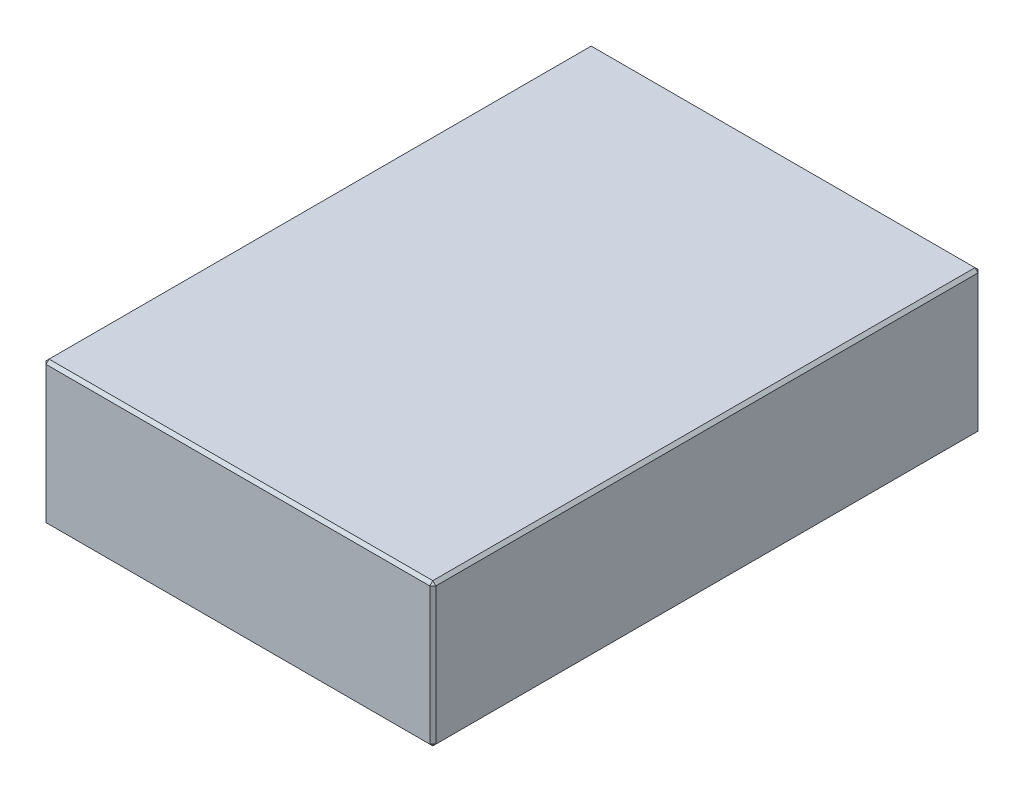
ISO-10303-21;
HEADER;
FILE_DESCRIPTION(('STEP AP214'),'2;1');
FILE_NAME('part.step','',(''),(''),'','','');
FILE_SCHEMA(('AUTOMOTIVE_DESIGN { 1 0 10303 214 1 1 1 1 }'));
ENDSEC;
DATA;
#1=APPLICATION_CONTEXT('core data for automotive mechanical design processes');
#2=APPLICATION_PROTOCOL_DEFINITION('international standard','automotive_design',2000,#1);
#3=PRODUCT_CONTEXT('',#1,'mechanical');
#4=PRODUCT('Part','Part','',(#3));
#5=PRODUCT_RELATED_PRODUCT_CATEGORY('part','',(#4));
#6=PRODUCT_DEFINITION_FORMATION('','',#4);
#7=PRODUCT_DEFINITION_CONTEXT('part definition',#1,'design');
#8=PRODUCT_DEFINITION('design','',#6,#7);
#9=PRODUCT_DEFINITION_SHAPE('','',#8);
#10=(LENGTH_UNIT() NAMED_UNIT(*) SI_UNIT(.MILLI.,.METRE.));
#11=(NAMED_UNIT(*) PLANE_ANGLE_UNIT() SI_UNIT($,.RADIAN.));
#12=(NAMED_UNIT(*) SI_UNIT($,.STERADIAN.) SOLID_ANGLE_UNIT());
#13=UNCERTAINTY_MEASURE_WITH_UNIT(LENGTH_MEASURE(1.E-05),#10,'distance_accuracy_value','');
#14=(GEOMETRIC_REPRESENTATION_CONTEXT(3) GLOBAL_UNCERTAINTY_ASSIGNED_CONTEXT((#13)) GLOBAL_UNIT_ASSIGNED_CONTEXT((#10,
#11,#12)) REPRESENTATION_CONTEXT('',''));
#15=CARTESIAN_POINT('',(0.,0.,0.));
#16=DIRECTION('',(0.,0.,1.));
#17=DIRECTION('',(1.,0.,0.));
#18=AXIS2_PLACEMENT_3D('',#15,#16,#17);
#19=CARTESIAN_POINT('',(0.,23.5,0.));
#20=DIRECTION('',(1.,0.,0.));
#21=DIRECTION('',(0.,0.,-1.));
#22=AXIS2_PLACEMENT_3D('',#19,#20,#21);
#23=PLANE('',#22);
#24=DIRECTION('',(0.,-1.,0.));
#25=VECTOR('',#24,1.);
#26=CARTESIAN_POINT('',(0.,23.5,-89.5));
#27=LINE('',#26,#25);
#28=CARTESIAN_POINT('',(0.,23.,-89.5));
#29=VERTEX_POINT('',#28);
#30=CARTESIAN_POINT('',(0.,0.5,-89.5));
#31=VERTEX_POINT('',#30);
#32=EDGE_CURVE('E147',#29,#31,#27,.T.);
#33=ORIENTED_EDGE('',*,*,#32,.T.);
#34=DIRECTION('',(0.,0.,1.));
#35=VECTOR('',#34,1.);
#36=CARTESIAN_POINT('',(0.,0.5,0.));
#37=LINE('',#36,#35);
#38=CARTESIAN_POINT('',(0.,0.5,-0.5));
#39=VERTEX_POINT('',#38);
#40=EDGE_CURVE('E142',#31,#39,#37,.T.);
#41=ORIENTED_EDGE('',*,*,#40,.T.);
#42=DIRECTION('',(0.,1.,0.));
#43=VECTOR('',#42,1.);
#44=CARTESIAN_POINT('',(0.,23.5,-0.5));
#45=LINE('',#44,#43);
#46=CARTESIAN_POINT('',(0.,23.,-0.5));
#47=VERTEX_POINT('',#46);
#48=EDGE_CURVE('E137',#39,#47,#45,.T.);
#49=ORIENTED_EDGE('',*,*,#48,.T.);
#50=DIRECTION('',(0.,0.,-1.));
#51=VECTOR('',#50,1.);
#52=CARTESIAN_POINT('',(0.,23.,0.));
#53=LINE('',#52,#51);
#54=EDGE_CURVE('E139',#47,#29,#53,.T.);
#55=ORIENTED_EDGE('',*,*,#54,.T.);
#56=EDGE_LOOP('',(#33,#41,#49,#55));
#57=FACE_BOUND('',#56,.T.);
#58=ADVANCED_FACE('F47',(#57),#23,.F.);
#59=CARTESIAN_POINT('',(0.,23.5,0.));
#60=DIRECTION('',(0.,0.,-1.));
#61=DIRECTION('',(-1.,0.,0.));
#62=AXIS2_PLACEMENT_3D('',#59,#60,#61);
#63=PLANE('',#62);
#64=DIRECTION('',(-1.,0.,0.));
#65=VECTOR('',#64,1.);
#66=CARTESIAN_POINT('',(0.,23.,0.));
#67=LINE('',#66,#65);
#68=CARTESIAN_POINT('',(63.5,23.,0.));
#69=VERTEX_POINT('',#68);
#70=CARTESIAN_POINT('',(0.5,23.,0.));
#71=VERTEX_POINT('',#70);
#72=EDGE_CURVE('E259',#69,#71,#67,.T.);
#73=ORIENTED_EDGE('',*,*,#72,.T.);
#74=DIRECTION('',(0.,-1.,0.));
#75=VECTOR('',#74,1.);
#76=CARTESIAN_POINT('',(0.5,23.5,0.));
#77=LINE('',#76,#75);
#78=CARTESIAN_POINT('',(0.5,0.5,0.));
#79=VERTEX_POINT('',#78);
#80=EDGE_CURVE('E171',#71,#79,#77,.T.);
#81=ORIENTED_EDGE('',*,*,#80,.T.);
#82=DIRECTION('',(1.,0.,0.));
#83=VECTOR('',#82,1.);
#84=CARTESIAN_POINT('',(64.,0.5,0.));
#85=LINE('',#84,#83);
#86=CARTESIAN_POINT('',(63.5,0.5,0.));
#87=VERTEX_POINT('',#86);
#88=EDGE_CURVE('E270',#79,#87,#85,.T.);
#89=ORIENTED_EDGE('',*,*,#88,.T.);
#90=DIRECTION('',(0.,1.,0.));
#91=VECTOR('',#90,1.);
#92=CARTESIAN_POINT('',(63.5,23.5,0.));
#93=LINE('',#92,#91);
#94=EDGE_CURVE('E263',#87,#69,#93,.T.);
#95=ORIENTED_EDGE('',*,*,#94,.T.);
#96=EDGE_LOOP('',(#73,#81,#89,#95));
#97=FACE_BOUND('',#96,.T.);
#98=ADVANCED_FACE('F384',(#97),#63,.F.);
#99=CARTESIAN_POINT('',(64.,23.5,0.));
#100=DIRECTION('',(-1.,0.,0.));
#101=DIRECTION('',(0.,0.,1.));
#102=AXIS2_PLACEMENT_3D('',#99,#100,#101);
#103=PLANE('',#102);
#104=DIRECTION('',(0.,0.,-1.));
#105=VECTOR('',#104,1.);
#106=CARTESIAN_POINT('',(64.,0.5,-90.));
#107=LINE('',#106,#105);
#108=CARTESIAN_POINT('',(64.,0.5,-0.5));
#109=VERTEX_POINT('',#108);
#110=CARTESIAN_POINT('',(64.,0.5,-89.5));
#111=VERTEX_POINT('',#110);
#112=EDGE_CURVE('E254',#109,#111,#107,.T.);
#113=ORIENTED_EDGE('',*,*,#112,.T.);
#114=DIRECTION('',(0.,1.,0.));
#115=VECTOR('',#114,1.);
#116=CARTESIAN_POINT('',(64.,23.5,-89.5));
#117=LINE('',#116,#115);
#118=CARTESIAN_POINT('',(64.,23.,-89.5));
#119=VERTEX_POINT('',#118);
#120=EDGE_CURVE('E251',#111,#119,#117,.T.);
#121=ORIENTED_EDGE('',*,*,#120,.T.);
#122=DIRECTION('',(0.,0.,1.));
#123=VECTOR('',#122,1.);
#124=CARTESIAN_POINT('',(64.,23.,0.));
#125=LINE('',#124,#123);
#126=CARTESIAN_POINT('',(64.,23.,-0.5));
#127=VERTEX_POINT('',#126);
#128=EDGE_CURVE('E243',#119,#127,#125,.T.);
#129=ORIENTED_EDGE('',*,*,#128,.T.);
#130=DIRECTION('',(0.,-1.,0.));
#131=VECTOR('',#130,1.);
#132=CARTESIAN_POINT('',(64.,23.5,-0.5));
#133=LINE('',#132,#131);
#134=EDGE_CURVE('E247',#127,#109,#133,.T.);
#135=ORIENTED_EDGE('',*,*,#134,.T.);
#136=EDGE_LOOP('',(#113,#121,#129,#135));
#137=FACE_BOUND('',#136,.T.);
#138=ADVANCED_FACE('F252',(#137),#103,.F.);
#139=CARTESIAN_POINT('',(0.,23.5,-90.));
#140=DIRECTION('',(0.,0.,1.));
#141=DIRECTION('',(1.,0.,0.));
#142=AXIS2_PLACEMENT_3D('',#139,#140,#141);
#143=PLANE('',#142);
#144=DIRECTION('',(-1.,0.,0.));
#145=VECTOR('',#144,1.);
#146=CARTESIAN_POINT('',(0.,0.5,-90.));
#147=LINE('',#146,#145);
#148=CARTESIAN_POINT('',(63.5,0.5,-90.));
#149=VERTEX_POINT('',#148);
#150=CARTESIAN_POINT('',(0.5,0.5,-90.));
#151=VERTEX_POINT('',#150);
#152=EDGE_CURVE('E335',#149,#151,#147,.T.);
#153=ORIENTED_EDGE('',*,*,#152,.T.);
#154=DIRECTION('',(0.,1.,0.));
#155=VECTOR('',#154,1.);
#156=CARTESIAN_POINT('',(0.5,23.5,-90.));
#157=LINE('',#156,#155);
#158=CARTESIAN_POINT('',(0.5,23.,-90.));
#159=VERTEX_POINT('',#158);
#160=EDGE_CURVE('E248',#151,#159,#157,.T.);
#161=ORIENTED_EDGE('',*,*,#160,.T.);
#162=DIRECTION('',(1.,0.,0.));
#163=VECTOR('',#162,1.);
#164=CARTESIAN_POINT('',(0.,23.,-90.));
#165=LINE('',#164,#163);
#166=CARTESIAN_POINT('',(63.5,23.,-90.));
#167=VERTEX_POINT('',#166);
#168=EDGE_CURVE('E326',#159,#167,#165,.T.);
#169=ORIENTED_EDGE('',*,*,#168,.T.);
#170=DIRECTION('',(0.,-1.,0.));
#171=VECTOR('',#170,1.);
#172=CARTESIAN_POINT('',(63.5,23.5,-90.));
#173=LINE('',#172,#171);
#174=EDGE_CURVE('E329',#167,#149,#173,.T.);
#175=ORIENTED_EDGE('',*,*,#174,.T.);
#176=EDGE_LOOP('',(#153,#161,#169,#175));
#177=FACE_BOUND('',#176,.T.);
#178=ADVANCED_FACE('F367',(#177),#143,.F.);
#179=CARTESIAN_POINT('',(0.,23.5,0.));
#180=DIRECTION('',(0.,-1.,0.));
#181=DIRECTION('',(0.,0.,-1.));
#182=AXIS2_PLACEMENT_3D('',#179,#180,#181);
#183=PLANE('',#182);
#184=DIRECTION('',(0.,0.,-1.));
#185=VECTOR('',#184,1.);
#186=CARTESIAN_POINT('',(63.5,23.5,0.));
#187=LINE('',#186,#185);
#188=CARTESIAN_POINT('',(63.5,23.5,-0.5));
#189=VERTEX_POINT('',#188);
#190=CARTESIAN_POINT('',(63.5,23.5,-89.5));
#191=VERTEX_POINT('',#190);
#192=EDGE_CURVE('E58',#189,#191,#187,.T.);
#193=ORIENTED_EDGE('',*,*,#192,.T.);
#194=DIRECTION('',(-1.,0.,0.));
#195=VECTOR('',#194,1.);
#196=CARTESIAN_POINT('',(0.,23.5,-89.5));
#197=LINE('',#196,#195);
#198=CARTESIAN_POINT('',(0.5,23.5,-89.5));
#199=VERTEX_POINT('',#198);
#200=EDGE_CURVE('E11',#191,#199,#197,.T.);
#201=ORIENTED_EDGE('',*,*,#200,.T.);
#202=DIRECTION('',(0.,0.,1.));
#203=VECTOR('',#202,1.);
#204=CARTESIAN_POINT('',(0.5,23.5,0.));
#205=LINE('',#204,#203);
#206=CARTESIAN_POINT('',(0.5,23.5,-0.5));
#207=VERTEX_POINT('',#206);
#208=EDGE_CURVE('E275',#199,#207,#205,.T.);
#209=ORIENTED_EDGE('',*,*,#208,.T.);
#210=DIRECTION('',(1.,0.,0.));
#211=VECTOR('',#210,1.);
#212=CARTESIAN_POINT('',(0.,23.5,-0.5));
#213=LINE('',#212,#211);
#214=EDGE_CURVE('E69',#207,#189,#213,.T.);
#215=ORIENTED_EDGE('',*,*,#214,.T.);
#216=EDGE_LOOP('',(#193,#201,#209,#215));
#217=FACE_BOUND('',#216,.T.);
#218=ADVANCED_FACE('F488',(#217),#183,.F.);
#219=CARTESIAN_POINT('',(0.,0.,0.));
#220=DIRECTION('',(0.,-1.,0.));
#221=DIRECTION('',(0.,0.,-1.));
#222=AXIS2_PLACEMENT_3D('',#219,#220,#221);
#223=PLANE('',#222);
#224=DIRECTION('',(-1.,0.,0.));
#225=VECTOR('',#224,1.);
#226=CARTESIAN_POINT('',(0.,0.,-0.5));
#227=LINE('',#226,#225);
#228=CARTESIAN_POINT('',(63.5,0.,-0.5));
#229=VERTEX_POINT('',#228);
#230=CARTESIAN_POINT('',(0.5,0.,-0.5));
#231=VERTEX_POINT('',#230);
#232=EDGE_CURVE('E321',#229,#231,#227,.T.);
#233=ORIENTED_EDGE('',*,*,#232,.T.);
#234=DIRECTION('',(0.,0.,-1.));
#235=VECTOR('',#234,1.);
#236=CARTESIAN_POINT('',(0.5,0.,-90.));
#237=LINE('',#236,#235);
#238=CARTESIAN_POINT('',(0.5,0.,-89.5));
#239=VERTEX_POINT('',#238);
#240=EDGE_CURVE('E315',#231,#239,#237,.T.);
#241=ORIENTED_EDGE('',*,*,#240,.T.);
#242=DIRECTION('',(1.,0.,0.));
#243=VECTOR('',#242,1.);
#244=CARTESIAN_POINT('',(64.,0.,-89.5));
#245=LINE('',#244,#243);
#246=CARTESIAN_POINT('',(63.5,0.,-89.5));
#247=VERTEX_POINT('',#246);
#248=EDGE_CURVE('E308',#239,#247,#245,.T.);
#249=ORIENTED_EDGE('',*,*,#248,.T.);
#250=DIRECTION('',(0.,0.,1.));
#251=VECTOR('',#250,1.);
#252=CARTESIAN_POINT('',(63.5,0.,0.));
#253=LINE('',#252,#251);
#254=EDGE_CURVE('E316',#247,#229,#253,.T.);
#255=ORIENTED_EDGE('',*,*,#254,.T.);
#256=EDGE_LOOP('',(#233,#241,#249,#255));
#257=FACE_BOUND('',#256,.T.);
#258=ADVANCED_FACE('F319',(#257),#223,.T.);
#259=CARTESIAN_POINT('',(63.5,23.5,0.));
#260=DIRECTION('',(-0.707106781186547,-0.707106781186547,0.));
#261=DIRECTION('',(0.,0.,-1.));
#262=AXIS2_PLACEMENT_3D('',#259,#260,#261);
#263=PLANE('',#262);
#264=DIRECTION('',(-0.707106781186547,0.707106781186547,0.));
#265=VECTOR('',#264,1.);
#266=CARTESIAN_POINT('',(64.,23.,-89.5));
#267=LINE('',#266,#265);
#268=EDGE_CURVE('E52',#191,#119,#267,.F.);
#269=ORIENTED_EDGE('',*,*,#268,.F.);
#270=ORIENTED_EDGE('',*,*,#192,.F.);
#271=DIRECTION('',(0.707106781186547,-0.707106781186547,0.));
#272=VECTOR('',#271,1.);
#273=CARTESIAN_POINT('',(63.75,23.25,-0.5));
#274=LINE('',#273,#272);
#275=EDGE_CURVE('E226',#127,#189,#274,.F.);
#276=ORIENTED_EDGE('',*,*,#275,.F.);
#277=ORIENTED_EDGE('',*,*,#128,.F.);
#278=EDGE_LOOP('',(#269,#270,#276,#277));
#279=FACE_BOUND('',#278,.T.);
#280=ADVANCED_FACE('F50',(#279),#263,.F.);
#281=CARTESIAN_POINT('',(64.,23.,-89.5));
#282=DIRECTION('',(0.577350269189626,0.577350269189626,-0.577350269189626));
#283=DIRECTION('',(-0.707106781186547,0.,-0.707106781186547));
#284=AXIS2_PLACEMENT_3D('',#281,#282,#283);
#285=PLANE('',#284);
#286=DIRECTION('',(0.,-0.707106781186547,-0.707106781186547));
#287=VECTOR('',#286,1.);
#288=CARTESIAN_POINT('',(63.5,23.25,-89.75));
#289=LINE('',#288,#287);
#290=EDGE_CURVE('E220',#191,#167,#289,.T.);
#291=ORIENTED_EDGE('',*,*,#290,.F.);
#292=ORIENTED_EDGE('',*,*,#268,.T.);
#293=DIRECTION('',(0.707106781186547,0.,0.707106781186547));
#294=VECTOR('',#293,1.);
#295=CARTESIAN_POINT('',(64.,23.,-89.5));
#296=LINE('',#295,#294);
#297=EDGE_CURVE('E224',#167,#119,#296,.T.);
#298=ORIENTED_EDGE('',*,*,#297,.F.);
#299=EDGE_LOOP('',(#291,#292,#298));
#300=FACE_BOUND('',#299,.T.);
#301=ADVANCED_FACE('F239',(#300),#285,.T.);
#302=CARTESIAN_POINT('',(63.5,23.,0.));
#303=DIRECTION('',(0.577350269189626,0.577350269189626,0.577350269189626));
#304=DIRECTION('',(0.707106781186547,0.,-0.707106781186547));
#305=AXIS2_PLACEMENT_3D('',#302,#303,#304);
#306=PLANE('',#305);
#307=DIRECTION('',(-0.707106781186547,0.,0.707106781186547));
#308=VECTOR('',#307,1.);
#309=CARTESIAN_POINT('',(63.5,23.,0.));
#310=LINE('',#309,#308);
#311=EDGE_CURVE('E212',#127,#69,#310,.T.);
#312=ORIENTED_EDGE('',*,*,#311,.F.);
#313=ORIENTED_EDGE('',*,*,#275,.T.);
#314=DIRECTION('',(0.,0.707106781186547,-0.707106781186547));
#315=VECTOR('',#314,1.);
#316=CARTESIAN_POINT('',(63.5,23.,0.));
#317=LINE('',#316,#315);
#318=EDGE_CURVE('E216',#69,#189,#317,.T.);
#319=ORIENTED_EDGE('',*,*,#318,.F.);
#320=EDGE_LOOP('',(#312,#313,#319));
#321=FACE_BOUND('',#320,.T.);
#322=ADVANCED_FACE('F475',(#321),#306,.T.);
#323=CARTESIAN_POINT('',(63.5,23.5,-90.));
#324=DIRECTION('',(-0.707106781186547,0.,0.707106781186547));
#325=DIRECTION('',(0.,-1.,0.));
#326=AXIS2_PLACEMENT_3D('',#323,#324,#325);
#327=PLANE('',#326);
#328=ORIENTED_EDGE('',*,*,#297,.T.);
#329=ORIENTED_EDGE('',*,*,#120,.F.);
#330=DIRECTION('',(-0.707106781186547,0.,-0.707106781186547));
#331=VECTOR('',#330,1.);
#332=CARTESIAN_POINT('',(63.75,0.5,-89.75));
#333=LINE('',#332,#331);
#334=EDGE_CURVE('E204',#149,#111,#333,.F.);
#335=ORIENTED_EDGE('',*,*,#334,.F.);
#336=ORIENTED_EDGE('',*,*,#174,.F.);
#337=EDGE_LOOP('',(#328,#329,#335,#336));
#338=FACE_BOUND('',#337,.T.);
#339=ADVANCED_FACE('F369',(#338),#327,.F.);
#340=CARTESIAN_POINT('',(0.,23.5,-89.5));
#341=DIRECTION('',(0.,-0.707106781186547,0.707106781186547));
#342=DIRECTION('',(-1.,0.,0.));
#343=AXIS2_PLACEMENT_3D('',#340,#341,#342);
#344=PLANE('',#343);
#345=ORIENTED_EDGE('',*,*,#290,.T.);
#346=ORIENTED_EDGE('',*,*,#168,.F.);
#347=DIRECTION('',(0.,0.707106781186547,0.707106781186547));
#348=VECTOR('',#347,1.);
#349=CARTESIAN_POINT('',(0.5,23.,-90.));
#350=LINE('',#349,#348);
#351=EDGE_CURVE('E200',#199,#159,#350,.F.);
#352=ORIENTED_EDGE('',*,*,#351,.F.);
#353=ORIENTED_EDGE('',*,*,#200,.F.);
#354=EDGE_LOOP('',(#345,#346,#352,#353));
#355=FACE_BOUND('',#354,.T.);
#356=ADVANCED_FACE('F466',(#355),#344,.F.);
#357=CARTESIAN_POINT('',(0.5,23.5,0.));
#358=DIRECTION('',(0.707106781186547,-0.707106781186547,0.));
#359=DIRECTION('',(0.,0.,1.));
#360=AXIS2_PLACEMENT_3D('',#357,#358,#359);
#361=PLANE('',#360);
#362=DIRECTION('',(0.707106781186547,0.707106781186547,0.));
#363=VECTOR('',#362,1.);
#364=CARTESIAN_POINT('',(0.,23.,-0.5));
#365=LINE('',#364,#363);
#366=EDGE_CURVE('E154',#207,#47,#365,.F.);
#367=ORIENTED_EDGE('',*,*,#366,.F.);
#368=ORIENTED_EDGE('',*,*,#208,.F.);
#369=DIRECTION('',(-0.707106781186547,-0.707106781186547,0.));
#370=VECTOR('',#369,1.);
#371=CARTESIAN_POINT('',(0.25,23.25,-89.5));
#372=LINE('',#371,#370);
#373=EDGE_CURVE('E156',#29,#199,#372,.F.);
#374=ORIENTED_EDGE('',*,*,#373,.F.);
#375=ORIENTED_EDGE('',*,*,#54,.F.);
#376=EDGE_LOOP('',(#367,#368,#374,#375));
#377=FACE_BOUND('',#376,.T.);
#378=ADVANCED_FACE('F152',(#377),#361,.F.);
#379=CARTESIAN_POINT('',(0.,23.5,-0.5));
#380=DIRECTION('',(0.,-0.707106781186547,-0.707106781186547));
#381=DIRECTION('',(1.,0.,0.));
#382=AXIS2_PLACEMENT_3D('',#379,#380,#381);
#383=PLANE('',#382);
#384=ORIENTED_EDGE('',*,*,#318,.T.);
#385=ORIENTED_EDGE('',*,*,#214,.F.);
#386=DIRECTION('',(0.,-0.707106781186547,0.707106781186547));
#387=VECTOR('',#386,1.);
#388=CARTESIAN_POINT('',(0.5,23.25,-0.25));
#389=LINE('',#388,#387);
#390=EDGE_CURVE('E166',#71,#207,#389,.F.);
#391=ORIENTED_EDGE('',*,*,#390,.F.);
#392=ORIENTED_EDGE('',*,*,#72,.F.);
#393=EDGE_LOOP('',(#384,#385,#391,#392));
#394=FACE_BOUND('',#393,.T.);
#395=ADVANCED_FACE('F457',(#394),#383,.F.);
#396=CARTESIAN_POINT('',(64.,23.5,-0.5));
#397=DIRECTION('',(-0.707106781186547,0.,-0.707106781186547));
#398=DIRECTION('',(0.,-1.,0.));
#399=AXIS2_PLACEMENT_3D('',#396,#397,#398);
#400=PLANE('',#399);
#401=ORIENTED_EDGE('',*,*,#311,.T.);
#402=ORIENTED_EDGE('',*,*,#94,.F.);
#403=DIRECTION('',(0.707106781186547,0.,-0.707106781186547));
#404=VECTOR('',#403,1.);
#405=CARTESIAN_POINT('',(63.75,0.5,-0.25));
#406=LINE('',#405,#404);
#407=EDGE_CURVE('E192',#109,#87,#406,.F.);
#408=ORIENTED_EDGE('',*,*,#407,.F.);
#409=ORIENTED_EDGE('',*,*,#134,.F.);
#410=EDGE_LOOP('',(#401,#402,#408,#409));
#411=FACE_BOUND('',#410,.T.);
#412=ADVANCED_FACE('F349',(#411),#400,.F.);
#413=CARTESIAN_POINT('',(64.,0.5,0.));
#414=DIRECTION('',(0.707106781186547,-0.707106781186547,0.));
#415=DIRECTION('',(0.,0.,1.));
#416=AXIS2_PLACEMENT_3D('',#413,#414,#415);
#417=PLANE('',#416);
#418=DIRECTION('',(-0.707106781186547,-0.707106781186547,0.));
#419=VECTOR('',#418,1.);
#420=CARTESIAN_POINT('',(63.5,0.,-89.5));
#421=LINE('',#420,#419);
#422=EDGE_CURVE('E208',#111,#247,#421,.T.);
#423=ORIENTED_EDGE('',*,*,#422,.F.);
#424=ORIENTED_EDGE('',*,*,#112,.F.);
#425=DIRECTION('',(0.707106781186547,0.707106781186547,0.));
#426=VECTOR('',#425,1.);
#427=CARTESIAN_POINT('',(63.5,0.,-0.5));
#428=LINE('',#427,#426);
#429=EDGE_CURVE('E188',#229,#109,#428,.T.);
#430=ORIENTED_EDGE('',*,*,#429,.F.);
#431=ORIENTED_EDGE('',*,*,#254,.F.);
#432=EDGE_LOOP('',(#423,#424,#430,#431));
#433=FACE_BOUND('',#432,.T.);
#434=ADVANCED_FACE('F346',(#433),#417,.T.);
#435=CARTESIAN_POINT('',(63.5,0.,-89.5));
#436=DIRECTION('',(0.577350269189626,-0.577350269189626,-0.577350269189626));
#437=DIRECTION('',(-0.707106781186547,0.,-0.707106781186547));
#438=AXIS2_PLACEMENT_3D('',#435,#436,#437);
#439=PLANE('',#438);
#440=ORIENTED_EDGE('',*,*,#334,.T.);
#441=ORIENTED_EDGE('',*,*,#422,.T.);
#442=DIRECTION('',(0.,0.707106781186547,-0.707106781186547));
#443=VECTOR('',#442,1.);
#444=CARTESIAN_POINT('',(63.5,0.,-89.5));
#445=LINE('',#444,#443);
#446=EDGE_CURVE('E178',#149,#247,#445,.F.);
#447=ORIENTED_EDGE('',*,*,#446,.F.);
#448=EDGE_LOOP('',(#440,#441,#447));
#449=FACE_BOUND('',#448,.T.);
#450=ADVANCED_FACE('F371',(#449),#439,.T.);
#451=CARTESIAN_POINT('',(0.5,23.,-90.));
#452=DIRECTION('',(-0.577350269189626,0.577350269189626,-0.577350269189626));
#453=DIRECTION('',(-0.707106781186547,0.,0.707106781186547));
#454=AXIS2_PLACEMENT_3D('',#451,#452,#453);
#455=PLANE('',#454);
#456=ORIENTED_EDGE('',*,*,#373,.T.);
#457=ORIENTED_EDGE('',*,*,#351,.T.);
#458=DIRECTION('',(0.707106781186547,0.,-0.707106781186547));
#459=VECTOR('',#458,1.);
#460=CARTESIAN_POINT('',(0.5,23.,-90.));
#461=LINE('',#460,#459);
#462=EDGE_CURVE('E173',#29,#159,#461,.T.);
#463=ORIENTED_EDGE('',*,*,#462,.F.);
#464=EDGE_LOOP('',(#456,#457,#463));
#465=FACE_BOUND('',#464,.T.);
#466=ADVANCED_FACE('F373',(#465),#455,.T.);
#467=CARTESIAN_POINT('',(0.,23.,-0.5));
#468=DIRECTION('',(-0.577350269189626,0.577350269189626,0.577350269189626));
#469=DIRECTION('',(0.707106781186547,0.,0.707106781186547));
#470=AXIS2_PLACEMENT_3D('',#467,#468,#469);
#471=PLANE('',#470);
#472=ORIENTED_EDGE('',*,*,#390,.T.);
#473=ORIENTED_EDGE('',*,*,#366,.T.);
#474=DIRECTION('',(-0.707106781186547,0.,-0.707106781186547));
#475=VECTOR('',#474,1.);
#476=CARTESIAN_POINT('',(0.,23.,-0.5));
#477=LINE('',#476,#475);
#478=EDGE_CURVE('E163',#71,#47,#477,.T.);
#479=ORIENTED_EDGE('',*,*,#478,.F.);
#480=EDGE_LOOP('',(#472,#473,#479));
#481=FACE_BOUND('',#480,.T.);
#482=ADVANCED_FACE('F162',(#481),#471,.T.);
#483=CARTESIAN_POINT('',(63.5,0.,-0.5));
#484=DIRECTION('',(0.577350269189626,-0.577350269189626,0.577350269189626));
#485=DIRECTION('',(0.707106781186547,0.,-0.707106781186547));
#486=AXIS2_PLACEMENT_3D('',#483,#484,#485);
#487=PLANE('',#486);
#488=ORIENTED_EDGE('',*,*,#429,.T.);
#489=ORIENTED_EDGE('',*,*,#407,.T.);
#490=DIRECTION('',(0.,-0.707106781186547,-0.707106781186547));
#491=VECTOR('',#490,1.);
#492=CARTESIAN_POINT('',(63.5,0.,-0.5));
#493=LINE('',#492,#491);
#494=EDGE_CURVE('E174',#229,#87,#493,.F.);
#495=ORIENTED_EDGE('',*,*,#494,.F.);
#496=EDGE_LOOP('',(#488,#489,#495));
#497=FACE_BOUND('',#496,.T.);
#498=ADVANCED_FACE('F351',(#497),#487,.T.);
#499=CARTESIAN_POINT('',(0.,0.5,-90.));
#500=DIRECTION('',(0.,-0.707106781186547,-0.707106781186547));
#501=DIRECTION('',(1.,0.,0.));
#502=AXIS2_PLACEMENT_3D('',#499,#500,#501);
#503=PLANE('',#502);
#504=ORIENTED_EDGE('',*,*,#446,.T.);
#505=ORIENTED_EDGE('',*,*,#248,.F.);
#506=DIRECTION('',(0.,-0.707106781186547,0.707106781186547));
#507=VECTOR('',#506,1.);
#508=CARTESIAN_POINT('',(0.5,0.,-89.5));
#509=LINE('',#508,#507);
#510=EDGE_CURVE('E181',#151,#239,#509,.T.);
#511=ORIENTED_EDGE('',*,*,#510,.F.);
#512=ORIENTED_EDGE('',*,*,#152,.F.);
#513=EDGE_LOOP('',(#504,#505,#511,#512));
#514=FACE_BOUND('',#513,.T.);
#515=ADVANCED_FACE('F310',(#514),#503,.T.);
#516=CARTESIAN_POINT('',(0.,23.5,-89.5));
#517=DIRECTION('',(0.707106781186547,0.,0.707106781186547));
#518=DIRECTION('',(0.,-1.,0.));
#519=AXIS2_PLACEMENT_3D('',#516,#517,#518);
#520=PLANE('',#519);
#521=ORIENTED_EDGE('',*,*,#462,.T.);
#522=ORIENTED_EDGE('',*,*,#160,.F.);
#523=DIRECTION('',(-0.707106781186547,0.,0.707106781186547));
#524=VECTOR('',#523,1.);
#525=CARTESIAN_POINT('',(0.25,0.5,-89.75));
#526=LINE('',#525,#524);
#527=EDGE_CURVE('E295',#31,#151,#526,.F.);
#528=ORIENTED_EDGE('',*,*,#527,.F.);
#529=ORIENTED_EDGE('',*,*,#32,.F.);
#530=EDGE_LOOP('',(#521,#522,#528,#529));
#531=FACE_BOUND('',#530,.T.);
#532=ADVANCED_FACE('F365',(#531),#520,.F.);
#533=CARTESIAN_POINT('',(0.5,23.5,0.));
#534=DIRECTION('',(0.707106781186547,0.,-0.707106781186547));
#535=DIRECTION('',(0.,-1.,0.));
#536=AXIS2_PLACEMENT_3D('',#533,#534,#535);
#537=PLANE('',#536);
#538=ORIENTED_EDGE('',*,*,#478,.T.);
#539=ORIENTED_EDGE('',*,*,#48,.F.);
#540=DIRECTION('',(0.707106781186547,0.,0.707106781186547));
#541=VECTOR('',#540,1.);
#542=CARTESIAN_POINT('',(0.,0.5,-0.5));
#543=LINE('',#542,#541);
#544=EDGE_CURVE('E291',#79,#39,#543,.F.);
#545=ORIENTED_EDGE('',*,*,#544,.F.);
#546=ORIENTED_EDGE('',*,*,#80,.F.);
#547=EDGE_LOOP('',(#538,#539,#545,#546));
#548=FACE_BOUND('',#547,.T.);
#549=ADVANCED_FACE('F169',(#548),#537,.F.);
#550=CARTESIAN_POINT('',(0.,0.5,0.));
#551=DIRECTION('',(0.,-0.707106781186547,0.707106781186547));
#552=DIRECTION('',(-1.,0.,0.));
#553=AXIS2_PLACEMENT_3D('',#550,#551,#552);
#554=PLANE('',#553);
#555=ORIENTED_EDGE('',*,*,#494,.T.);
#556=ORIENTED_EDGE('',*,*,#88,.F.);
#557=DIRECTION('',(0.,0.707106781186547,0.707106781186547));
#558=VECTOR('',#557,1.);
#559=CARTESIAN_POINT('',(0.5,0.25,-0.25));
#560=LINE('',#559,#558);
#561=EDGE_CURVE('E288',#231,#79,#560,.T.);
#562=ORIENTED_EDGE('',*,*,#561,.F.);
#563=ORIENTED_EDGE('',*,*,#232,.F.);
#564=EDGE_LOOP('',(#555,#556,#562,#563));
#565=FACE_BOUND('',#564,.T.);
#566=ADVANCED_FACE('F354',(#565),#554,.T.);
#567=CARTESIAN_POINT('',(0.5,0.,-89.5));
#568=DIRECTION('',(-0.577350269189626,-0.577350269189626,-0.577350269189626));
#569=DIRECTION('',(-0.707106781186547,0.,0.707106781186547));
#570=AXIS2_PLACEMENT_3D('',#567,#568,#569);
#571=PLANE('',#570);
#572=ORIENTED_EDGE('',*,*,#527,.T.);
#573=ORIENTED_EDGE('',*,*,#510,.T.);
#574=DIRECTION('',(-0.707106781186547,0.707106781186547,0.));
#575=VECTOR('',#574,1.);
#576=CARTESIAN_POINT('',(0.5,0.,-89.5));
#577=LINE('',#576,#575);
#578=EDGE_CURVE('E285',#31,#239,#577,.F.);
#579=ORIENTED_EDGE('',*,*,#578,.F.);
#580=EDGE_LOOP('',(#572,#573,#579));
#581=FACE_BOUND('',#580,.T.);
#582=ADVANCED_FACE('F304',(#581),#571,.T.);
#583=CARTESIAN_POINT('',(0.,0.5,-0.5));
#584=DIRECTION('',(-0.577350269189626,-0.577350269189626,0.577350269189626));
#585=DIRECTION('',(0.707106781186547,0.,0.707106781186547));
#586=AXIS2_PLACEMENT_3D('',#583,#584,#585);
#587=PLANE('',#586);
#588=ORIENTED_EDGE('',*,*,#561,.T.);
#589=ORIENTED_EDGE('',*,*,#544,.T.);
#590=DIRECTION('',(0.707106781186547,-0.707106781186547,0.));
#591=VECTOR('',#590,1.);
#592=CARTESIAN_POINT('',(0.,0.5,-0.5));
#593=LINE('',#592,#591);
#594=EDGE_CURVE('E282',#231,#39,#593,.F.);
#595=ORIENTED_EDGE('',*,*,#594,.F.);
#596=EDGE_LOOP('',(#588,#589,#595));
#597=FACE_BOUND('',#596,.T.);
#598=ADVANCED_FACE('F400',(#597),#587,.T.);
#599=CARTESIAN_POINT('',(0.,0.5,0.));
#600=DIRECTION('',(-0.707106781186547,-0.707106781186547,0.));
#601=DIRECTION('',(0.,0.,-1.));
#602=AXIS2_PLACEMENT_3D('',#599,#600,#601);
#603=PLANE('',#602);
#604=ORIENTED_EDGE('',*,*,#578,.T.);
#605=ORIENTED_EDGE('',*,*,#240,.F.);
#606=ORIENTED_EDGE('',*,*,#594,.T.);
#607=ORIENTED_EDGE('',*,*,#40,.F.);
#608=EDGE_LOOP('',(#604,#605,#606,#607));
#609=FACE_BOUND('',#608,.T.);
#610=ADVANCED_FACE('F394',(#609),#603,.T.);
#611=CLOSED_SHELL('',(#58,#98,#138,#178,#218,#258,#280,#301,#322,#339,#356,#378,#395,#412,#434,
#450,#466,#482,#498,#515,#532,#549,#566,#582,#598,#610));
#612=MANIFOLD_SOLID_BREP('B2',#611);
#613=ADVANCED_BREP_SHAPE_REPRESENTATION('',(#18,#612),#14);
#614=SHAPE_DEFINITION_REPRESENTATION(#9,#613);
ENDSEC;
END-ISO-10303-21;
